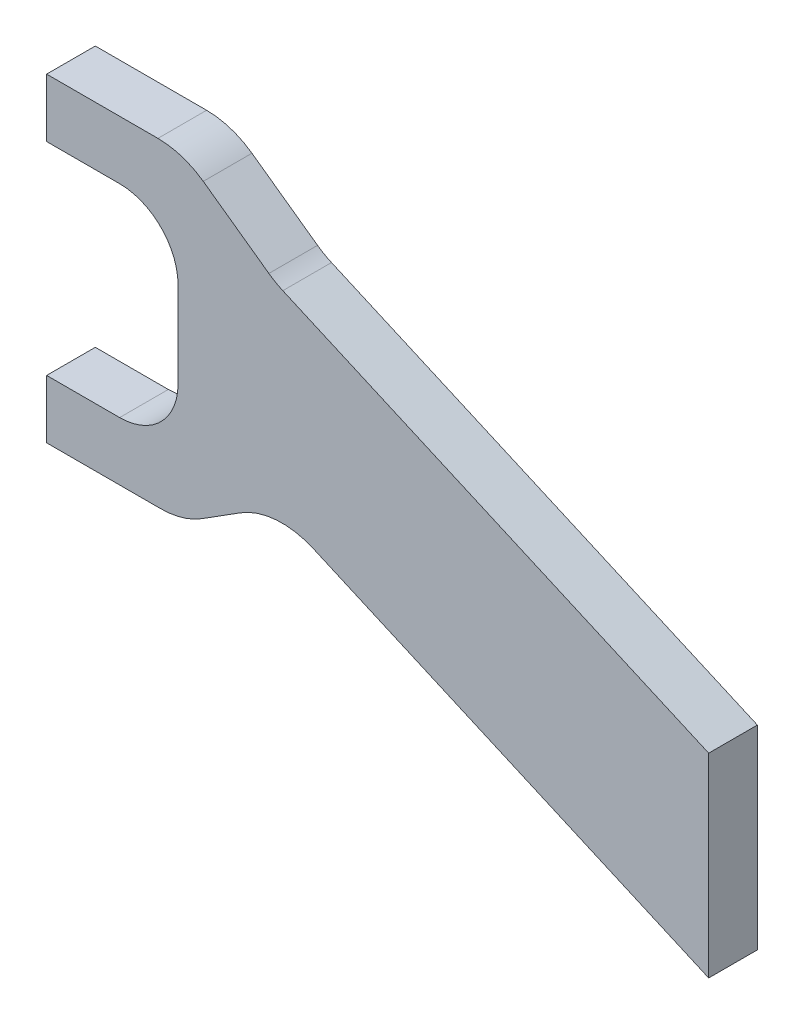
ISO-10303-21;
HEADER;
FILE_DESCRIPTION(('STEP AP214'),'2;1');
FILE_NAME('part.step','',(''),(''),'','','');
FILE_SCHEMA(('AUTOMOTIVE_DESIGN { 1 0 10303 214 1 1 1 1 }'));
ENDSEC;
DATA;
#1=APPLICATION_CONTEXT('core data for automotive mechanical design processes');
#2=APPLICATION_PROTOCOL_DEFINITION('international standard','automotive_design',2000,#1);
#3=PRODUCT_CONTEXT('',#1,'mechanical');
#4=PRODUCT('Part','Part','',(#3));
#5=PRODUCT_RELATED_PRODUCT_CATEGORY('part','',(#4));
#6=PRODUCT_DEFINITION_FORMATION('','',#4);
#7=PRODUCT_DEFINITION_CONTEXT('part definition',#1,'design');
#8=PRODUCT_DEFINITION('design','',#6,#7);
#9=PRODUCT_DEFINITION_SHAPE('','',#8);
#10=(LENGTH_UNIT() NAMED_UNIT(*) SI_UNIT(.MILLI.,.METRE.));
#11=(NAMED_UNIT(*) PLANE_ANGLE_UNIT() SI_UNIT($,.RADIAN.));
#12=(NAMED_UNIT(*) SI_UNIT($,.STERADIAN.) SOLID_ANGLE_UNIT());
#13=UNCERTAINTY_MEASURE_WITH_UNIT(LENGTH_MEASURE(1.E-05),#10,'distance_accuracy_value','');
#14=(GEOMETRIC_REPRESENTATION_CONTEXT(3) GLOBAL_UNCERTAINTY_ASSIGNED_CONTEXT((#13)) GLOBAL_UNIT_ASSIGNED_CONTEXT((#10,
#11,#12)) REPRESENTATION_CONTEXT('',''));
#15=CARTESIAN_POINT('',(0.,0.,0.));
#16=DIRECTION('',(0.,0.,1.));
#17=DIRECTION('',(1.,0.,0.));
#18=AXIS2_PLACEMENT_3D('',#15,#16,#17);
#19=CARTESIAN_POINT('',(0.7,1.64,0.125));
#20=DIRECTION('',(0.,-1.,0.));
#21=DIRECTION('',(1.,0.,0.));
#22=AXIS2_PLACEMENT_3D('',#19,#20,#21);
#23=PLANE('',#22);
#24=DIRECTION('',(-1.,0.,0.));
#25=VECTOR('',#24,1.);
#26=CARTESIAN_POINT('',(0.7,1.64,0.125));
#27=LINE('',#26,#25);
#28=CARTESIAN_POINT('',(0.571594501340175,1.64,0.125));
#29=VERTEX_POINT('',#28);
#30=CARTESIAN_POINT('',(0.,1.64,0.125));
#31=VERTEX_POINT('',#30);
#32=EDGE_CURVE('E156',#29,#31,#27,.T.);
#33=ORIENTED_EDGE('',*,*,#32,.F.);
#34=DIRECTION('',(0.,0.,-1.));
#35=VECTOR('',#34,1.);
#36=CARTESIAN_POINT('',(0.571594501340175,1.64,0.125));
#37=LINE('',#36,#35);
#38=CARTESIAN_POINT('',(0.571594501340175,1.64,-0.125));
#39=VERTEX_POINT('',#38);
#40=EDGE_CURVE('E229',#29,#39,#37,.T.);
#41=ORIENTED_EDGE('',*,*,#40,.T.);
#42=DIRECTION('',(-1.,0.,0.));
#43=VECTOR('',#42,1.);
#44=CARTESIAN_POINT('',(0.7,1.64,-0.125));
#45=LINE('',#44,#43);
#46=CARTESIAN_POINT('',(0.,1.64,-0.125));
#47=VERTEX_POINT('',#46);
#48=EDGE_CURVE('E181',#39,#47,#45,.T.);
#49=ORIENTED_EDGE('',*,*,#48,.T.);
#50=DIRECTION('',(0.,0.,-1.));
#51=VECTOR('',#50,1.);
#52=CARTESIAN_POINT('',(0.,1.64,0.125));
#53=LINE('',#52,#51);
#54=EDGE_CURVE('E174',#31,#47,#53,.T.);
#55=ORIENTED_EDGE('',*,*,#54,.F.);
#56=EDGE_LOOP('',(#33,#41,#49,#55));
#57=FACE_BOUND('',#56,.T.);
#58=ADVANCED_FACE('F33',(#57),#23,.F.);
#59=CARTESIAN_POINT('',(0.,1.64,0.125));
#60=DIRECTION('',(1.,0.,0.));
#61=DIRECTION('',(0.,1.,0.));
#62=AXIS2_PLACEMENT_3D('',#59,#60,#61);
#63=PLANE('',#62);
#64=DIRECTION('',(0.,-1.,0.));
#65=VECTOR('',#64,1.);
#66=CARTESIAN_POINT('',(0.,1.64,-0.125));
#67=LINE('',#66,#65);
#68=CARTESIAN_POINT('',(0.,1.34,-0.125));
#69=VERTEX_POINT('',#68);
#70=EDGE_CURVE('E265',#47,#69,#67,.T.);
#71=ORIENTED_EDGE('',*,*,#70,.T.);
#72=DIRECTION('',(0.,0.,-1.));
#73=VECTOR('',#72,1.);
#74=CARTESIAN_POINT('',(0.,1.34,0.125));
#75=LINE('',#74,#73);
#76=CARTESIAN_POINT('',(0.,1.34,0.125));
#77=VERTEX_POINT('',#76);
#78=EDGE_CURVE('E176',#77,#69,#75,.T.);
#79=ORIENTED_EDGE('',*,*,#78,.F.);
#80=DIRECTION('',(0.,-1.,0.));
#81=VECTOR('',#80,1.);
#82=CARTESIAN_POINT('',(0.,1.64,0.125));
#83=LINE('',#82,#81);
#84=EDGE_CURVE('E161',#31,#77,#83,.T.);
#85=ORIENTED_EDGE('',*,*,#84,.F.);
#86=ORIENTED_EDGE('',*,*,#54,.T.);
#87=EDGE_LOOP('',(#71,#79,#85,#86));
#88=FACE_BOUND('',#87,.T.);
#89=ADVANCED_FACE('F173',(#88),#63,.F.);
#90=CARTESIAN_POINT('',(0.,1.34,0.125));
#91=DIRECTION('',(0.,1.,0.));
#92=DIRECTION('',(0.,0.,1.));
#93=AXIS2_PLACEMENT_3D('',#90,#91,#92);
#94=PLANE('',#93);
#95=DIRECTION('',(1.,0.,0.));
#96=VECTOR('',#95,1.);
#97=CARTESIAN_POINT('',(0.,1.34,-0.125));
#98=LINE('',#97,#96);
#99=CARTESIAN_POINT('',(0.375,1.34,-0.125));
#100=VERTEX_POINT('',#99);
#101=EDGE_CURVE('E267',#69,#100,#98,.T.);
#102=ORIENTED_EDGE('',*,*,#101,.T.);
#103=DIRECTION('',(0.,0.,-1.));
#104=VECTOR('',#103,1.);
#105=CARTESIAN_POINT('',(0.375,1.34,0.125));
#106=LINE('',#105,#104);
#107=CARTESIAN_POINT('',(0.375,1.34,0.125));
#108=VERTEX_POINT('',#107);
#109=EDGE_CURVE('E196',#100,#108,#106,.F.);
#110=ORIENTED_EDGE('',*,*,#109,.T.);
#111=DIRECTION('',(1.,0.,0.));
#112=VECTOR('',#111,1.);
#113=CARTESIAN_POINT('',(0.,1.34,0.125));
#114=LINE('',#113,#112);
#115=EDGE_CURVE('E178',#77,#108,#114,.T.);
#116=ORIENTED_EDGE('',*,*,#115,.F.);
#117=ORIENTED_EDGE('',*,*,#78,.T.);
#118=EDGE_LOOP('',(#102,#110,#116,#117));
#119=FACE_BOUND('',#118,.T.);
#120=ADVANCED_FACE('F348',(#119),#94,.F.);
#121=CARTESIAN_POINT('',(0.675,1.34,0.125));
#122=DIRECTION('',(1.,0.,0.));
#123=DIRECTION('',(0.,0.,-1.));
#124=AXIS2_PLACEMENT_3D('',#121,#122,#123);
#125=PLANE('',#124);
#126=DIRECTION('',(0.,-1.,0.));
#127=VECTOR('',#126,1.);
#128=CARTESIAN_POINT('',(0.675,1.34,-0.125));
#129=LINE('',#128,#127);
#130=CARTESIAN_POINT('',(0.675,1.04,-0.125));
#131=VERTEX_POINT('',#130);
#132=CARTESIAN_POINT('',(0.675,0.6,-0.125));
#133=VERTEX_POINT('',#132);
#134=EDGE_CURVE('E270',#131,#133,#129,.T.);
#135=ORIENTED_EDGE('',*,*,#134,.T.);
#136=DIRECTION('',(0.,0.,-1.));
#137=VECTOR('',#136,1.);
#138=CARTESIAN_POINT('',(0.675,0.6,0.125));
#139=LINE('',#138,#137);
#140=CARTESIAN_POINT('',(0.675,0.6,0.125));
#141=VERTEX_POINT('',#140);
#142=EDGE_CURVE('E194',#133,#141,#139,.F.);
#143=ORIENTED_EDGE('',*,*,#142,.T.);
#144=DIRECTION('',(0.,-1.,0.));
#145=VECTOR('',#144,1.);
#146=CARTESIAN_POINT('',(0.675,1.34,0.125));
#147=LINE('',#146,#145);
#148=CARTESIAN_POINT('',(0.675,1.04,0.125));
#149=VERTEX_POINT('',#148);
#150=EDGE_CURVE('E365',#149,#141,#147,.T.);
#151=ORIENTED_EDGE('',*,*,#150,.F.);
#152=DIRECTION('',(0.,0.,-1.));
#153=VECTOR('',#152,1.);
#154=CARTESIAN_POINT('',(0.675,1.04,-0.125));
#155=LINE('',#154,#153);
#156=EDGE_CURVE('E186',#149,#131,#155,.T.);
#157=ORIENTED_EDGE('',*,*,#156,.T.);
#158=EDGE_LOOP('',(#135,#143,#151,#157));
#159=FACE_BOUND('',#158,.T.);
#160=ADVANCED_FACE('F368',(#159),#125,.F.);
#161=CARTESIAN_POINT('',(0.675,0.3,0.125));
#162=DIRECTION('',(0.,-1.,0.));
#163=DIRECTION('',(1.,0.,0.));
#164=AXIS2_PLACEMENT_3D('',#161,#162,#163);
#165=PLANE('',#164);
#166=DIRECTION('',(-1.,0.,0.));
#167=VECTOR('',#166,1.);
#168=CARTESIAN_POINT('',(0.675,0.3,0.125));
#169=LINE('',#168,#167);
#170=CARTESIAN_POINT('',(0.375,0.3,0.125));
#171=VERTEX_POINT('',#170);
#172=CARTESIAN_POINT('',(0.,0.3,0.125));
#173=VERTEX_POINT('',#172);
#174=EDGE_CURVE('E371',#171,#173,#169,.T.);
#175=ORIENTED_EDGE('',*,*,#174,.F.);
#176=DIRECTION('',(0.,0.,-1.));
#177=VECTOR('',#176,1.);
#178=CARTESIAN_POINT('',(0.375,0.3,-0.125));
#179=LINE('',#178,#177);
#180=CARTESIAN_POINT('',(0.375,0.3,-0.125));
#181=VERTEX_POINT('',#180);
#182=EDGE_CURVE('E183',#171,#181,#179,.T.);
#183=ORIENTED_EDGE('',*,*,#182,.T.);
#184=DIRECTION('',(-1.,0.,0.));
#185=VECTOR('',#184,1.);
#186=CARTESIAN_POINT('',(0.675,0.3,-0.125));
#187=LINE('',#186,#185);
#188=CARTESIAN_POINT('',(0.,0.3,-0.125));
#189=VERTEX_POINT('',#188);
#190=EDGE_CURVE('E273',#181,#189,#187,.T.);
#191=ORIENTED_EDGE('',*,*,#190,.T.);
#192=DIRECTION('',(0.,0.,-1.));
#193=VECTOR('',#192,1.);
#194=CARTESIAN_POINT('',(0.,0.3,0.125));
#195=LINE('',#194,#193);
#196=EDGE_CURVE('E188',#173,#189,#195,.T.);
#197=ORIENTED_EDGE('',*,*,#196,.F.);
#198=EDGE_LOOP('',(#175,#183,#191,#197));
#199=FACE_BOUND('',#198,.T.);
#200=ADVANCED_FACE('F376',(#199),#165,.F.);
#201=CARTESIAN_POINT('',(0.,0.3,0.125));
#202=DIRECTION('',(1.,0.,0.));
#203=DIRECTION('',(0.,1.,0.));
#204=AXIS2_PLACEMENT_3D('',#201,#202,#203);
#205=PLANE('',#204);
#206=DIRECTION('',(0.,-1.,0.));
#207=VECTOR('',#206,1.);
#208=CARTESIAN_POINT('',(0.,0.3,-0.125));
#209=LINE('',#208,#207);
#210=CARTESIAN_POINT('',(0.,0.,-0.125));
#211=VERTEX_POINT('',#210);
#212=EDGE_CURVE('E275',#189,#211,#209,.T.);
#213=ORIENTED_EDGE('',*,*,#212,.T.);
#214=DIRECTION('',(0.,0.,-1.));
#215=VECTOR('',#214,1.);
#216=CARTESIAN_POINT('',(0.,0.,0.125));
#217=LINE('',#216,#215);
#218=CARTESIAN_POINT('',(0.,0.,0.125));
#219=VERTEX_POINT('',#218);
#220=EDGE_CURVE('E289',#219,#211,#217,.T.);
#221=ORIENTED_EDGE('',*,*,#220,.F.);
#222=DIRECTION('',(0.,-1.,0.));
#223=VECTOR('',#222,1.);
#224=CARTESIAN_POINT('',(0.,0.3,0.125));
#225=LINE('',#224,#223);
#226=EDGE_CURVE('E298',#173,#219,#225,.T.);
#227=ORIENTED_EDGE('',*,*,#226,.F.);
#228=ORIENTED_EDGE('',*,*,#196,.T.);
#229=EDGE_LOOP('',(#213,#221,#227,#228));
#230=FACE_BOUND('',#229,.T.);
#231=ADVANCED_FACE('F296',(#230),#205,.F.);
#232=CARTESIAN_POINT('',(0.,0.,0.125));
#233=DIRECTION('',(0.,1.,0.));
#234=DIRECTION('',(0.,0.,1.));
#235=AXIS2_PLACEMENT_3D('',#232,#233,#234);
#236=PLANE('',#235);
#237=DIRECTION('',(1.,0.,0.));
#238=VECTOR('',#237,1.);
#239=CARTESIAN_POINT('',(0.,0.,-0.125));
#240=LINE('',#239,#238);
#241=CARTESIAN_POINT('',(0.584259831525192,0.,-0.125));
#242=VERTEX_POINT('',#241);
#243=EDGE_CURVE('E277',#211,#242,#240,.T.);
#244=ORIENTED_EDGE('',*,*,#243,.T.);
#245=DIRECTION('',(0.,0.,-1.));
#246=VECTOR('',#245,1.);
#247=CARTESIAN_POINT('',(0.584259831525192,0.,0.125));
#248=LINE('',#247,#246);
#249=CARTESIAN_POINT('',(0.584259831525192,0.,0.125));
#250=VERTEX_POINT('',#249);
#251=EDGE_CURVE('E215',#242,#250,#248,.F.);
#252=ORIENTED_EDGE('',*,*,#251,.T.);
#253=DIRECTION('',(1.,0.,0.));
#254=VECTOR('',#253,1.);
#255=CARTESIAN_POINT('',(0.,0.,0.125));
#256=LINE('',#255,#254);
#257=EDGE_CURVE('E315',#219,#250,#256,.T.);
#258=ORIENTED_EDGE('',*,*,#257,.F.);
#259=ORIENTED_EDGE('',*,*,#220,.T.);
#260=EDGE_LOOP('',(#244,#252,#258,#259));
#261=FACE_BOUND('',#260,.T.);
#262=ADVANCED_FACE('F305',(#261),#236,.F.);
#263=CARTESIAN_POINT('',(0.7,0.,0.125));
#264=DIRECTION('',(-0.533992991387982,0.845488903030971,0.));
#265=DIRECTION('',(-0.845488903030971,-0.533992991387982,0.));
#266=AXIS2_PLACEMENT_3D('',#263,#264,#265);
#267=PLANE('',#266);
#268=DIRECTION('',(0.845488903030971,0.533992991387982,0.));
#269=VECTOR('',#268,1.);
#270=CARTESIAN_POINT('',(0.7,0.,0.125));
#271=LINE('',#270,#269);
#272=CARTESIAN_POINT('',(0.797857028080385,0.0618044387876115,0.125));
#273=VERTEX_POINT('',#272);
#274=CARTESIAN_POINT('',(0.995001364598637,0.186316651325455,0.125));
#275=VERTEX_POINT('',#274);
#276=EDGE_CURVE('E313',#273,#275,#271,.T.);
#277=ORIENTED_EDGE('',*,*,#276,.F.);
#278=DIRECTION('',(0.,0.,-1.));
#279=VECTOR('',#278,1.);
#280=CARTESIAN_POINT('',(0.797857028080385,0.0618044387876115,0.125));
#281=LINE('',#280,#279);
#282=CARTESIAN_POINT('',(0.797857028080385,0.0618044387876115,-0.125));
#283=VERTEX_POINT('',#282);
#284=EDGE_CURVE('E208',#273,#283,#281,.T.);
#285=ORIENTED_EDGE('',*,*,#284,.T.);
#286=DIRECTION('',(0.845488903030971,0.533992991387982,0.));
#287=VECTOR('',#286,1.);
#288=CARTESIAN_POINT('',(0.7,0.,-0.125));
#289=LINE('',#288,#287);
#290=CARTESIAN_POINT('',(0.995001364598637,0.186316651325455,-0.125));
#291=VERTEX_POINT('',#290);
#292=EDGE_CURVE('E280',#283,#291,#289,.T.);
#293=ORIENTED_EDGE('',*,*,#292,.T.);
#294=DIRECTION('',(0.,0.,-1.));
#295=VECTOR('',#294,1.);
#296=CARTESIAN_POINT('',(0.995001364598637,0.186316651325455,0.125));
#297=LINE('',#296,#295);
#298=EDGE_CURVE('E206',#291,#275,#297,.F.);
#299=ORIENTED_EDGE('',*,*,#298,.T.);
#300=EDGE_LOOP('',(#277,#285,#293,#299));
#301=FACE_BOUND('',#300,.T.);
#302=ADVANCED_FACE('F317',(#301),#267,.F.);
#303=CARTESIAN_POINT('',(1.175,0.3,0.125));
#304=DIRECTION('',(0.403083181375616,0.915163345470147,0.));
#305=DIRECTION('',(-0.915163345470148,0.403083181375616,0.));
#306=AXIS2_PLACEMENT_3D('',#303,#304,#305);
#307=PLANE('',#306);
#308=DIRECTION('',(0.915163345470147,-0.403083181375616,0.));
#309=VECTOR('',#308,1.);
#310=CARTESIAN_POINT('',(1.175,0.3,0.125));
#311=LINE('',#310,#309);
#312=CARTESIAN_POINT('',(1.36983183370408,0.214186428301126,0.125));
#313=VERTEX_POINT('',#312);
#314=CARTESIAN_POINT('',(3.4,-0.68,0.125));
#315=VERTEX_POINT('',#314);
#316=EDGE_CURVE('E319',#313,#315,#311,.T.);
#317=ORIENTED_EDGE('',*,*,#316,.F.);
#318=DIRECTION('',(0.,0.,-1.));
#319=VECTOR('',#318,1.);
#320=CARTESIAN_POINT('',(1.36983183370408,0.214186428301126,-0.125));
#321=LINE('',#320,#319);
#322=CARTESIAN_POINT('',(1.36983183370408,0.214186428301126,-0.125));
#323=VERTEX_POINT('',#322);
#324=EDGE_CURVE('E220',#313,#323,#321,.T.);
#325=ORIENTED_EDGE('',*,*,#324,.T.);
#326=DIRECTION('',(0.915163345470147,-0.403083181375616,0.));
#327=VECTOR('',#326,1.);
#328=CARTESIAN_POINT('',(1.175,0.3,-0.125));
#329=LINE('',#328,#327);
#330=CARTESIAN_POINT('',(3.4,-0.68,-0.125));
#331=VERTEX_POINT('',#330);
#332=EDGE_CURVE('E283',#323,#331,#329,.T.);
#333=ORIENTED_EDGE('',*,*,#332,.T.);
#334=DIRECTION('',(0.,0.,-1.));
#335=VECTOR('',#334,1.);
#336=CARTESIAN_POINT('',(3.4,-0.68,0.125));
#337=LINE('',#336,#335);
#338=EDGE_CURVE('E258',#315,#331,#337,.T.);
#339=ORIENTED_EDGE('',*,*,#338,.F.);
#340=EDGE_LOOP('',(#317,#325,#333,#339));
#341=FACE_BOUND('',#340,.T.);
#342=ADVANCED_FACE('F331',(#341),#307,.F.);
#343=CARTESIAN_POINT('',(3.4,-0.68,0.125));
#344=DIRECTION('',(-1.,0.,0.));
#345=DIRECTION('',(0.,0.,1.));
#346=AXIS2_PLACEMENT_3D('',#343,#344,#345);
#347=PLANE('',#346);
#348=DIRECTION('',(0.,1.,0.));
#349=VECTOR('',#348,1.);
#350=CARTESIAN_POINT('',(3.4,-0.68,-0.125));
#351=LINE('',#350,#349);
#352=CARTESIAN_POINT('',(3.4,0.32,-0.125));
#353=VERTEX_POINT('',#352);
#354=EDGE_CURVE('E251',#331,#353,#351,.T.);
#355=ORIENTED_EDGE('',*,*,#354,.T.);
#356=DIRECTION('',(0.,0.,-1.));
#357=VECTOR('',#356,1.);
#358=CARTESIAN_POINT('',(3.4,0.32,0.125));
#359=LINE('',#358,#357);
#360=CARTESIAN_POINT('',(3.4,0.32,0.125));
#361=VERTEX_POINT('',#360);
#362=EDGE_CURVE('E250',#361,#353,#359,.T.);
#363=ORIENTED_EDGE('',*,*,#362,.F.);
#364=DIRECTION('',(0.,1.,0.));
#365=VECTOR('',#364,1.);
#366=CARTESIAN_POINT('',(3.4,-0.68,0.125));
#367=LINE('',#366,#365);
#368=EDGE_CURVE('E260',#315,#361,#367,.T.);
#369=ORIENTED_EDGE('',*,*,#368,.F.);
#370=ORIENTED_EDGE('',*,*,#338,.T.);
#371=EDGE_LOOP('',(#355,#363,#369,#370));
#372=FACE_BOUND('',#371,.T.);
#373=ADVANCED_FACE('F328',(#372),#347,.F.);
#374=CARTESIAN_POINT('',(3.4,0.32,0.125));
#375=DIRECTION('',(-0.403083181375616,-0.915163345470147,0.));
#376=DIRECTION('',(0.915163345470148,-0.403083181375616,0.));
#377=AXIS2_PLACEMENT_3D('',#374,#375,#376);
#378=PLANE('',#377);
#379=DIRECTION('',(-0.915163345470147,0.403083181375615,0.));
#380=VECTOR('',#379,1.);
#381=CARTESIAN_POINT('',(3.4,0.32,-0.125));
#382=LINE('',#381,#380);
#383=CARTESIAN_POINT('',(1.21290544589138,1.28330456765234,-0.125));
#384=VERTEX_POINT('',#383);
#385=EDGE_CURVE('E241',#353,#384,#382,.T.);
#386=ORIENTED_EDGE('',*,*,#385,.T.);
#387=DIRECTION('',(0.,0.,-1.));
#388=VECTOR('',#387,1.);
#389=CARTESIAN_POINT('',(1.21290544589138,1.28330456765234,0.125));
#390=LINE('',#389,#388);
#391=CARTESIAN_POINT('',(1.21290544589138,1.28330456765234,0.125));
#392=VERTEX_POINT('',#391);
#393=EDGE_CURVE('E227',#384,#392,#390,.F.);
#394=ORIENTED_EDGE('',*,*,#393,.T.);
#395=DIRECTION('',(-0.915163345470147,0.403083181375615,0.));
#396=VECTOR('',#395,1.);
#397=CARTESIAN_POINT('',(3.4,0.32,0.125));
#398=LINE('',#397,#396);
#399=EDGE_CURVE('E256',#361,#392,#398,.T.);
#400=ORIENTED_EDGE('',*,*,#399,.F.);
#401=ORIENTED_EDGE('',*,*,#362,.T.);
#402=EDGE_LOOP('',(#386,#394,#400,#401));
#403=FACE_BOUND('',#402,.T.);
#404=ADVANCED_FACE('F247',(#403),#378,.F.);
#405=CARTESIAN_POINT('',(1.175,1.3,0.125));
#406=DIRECTION('',(-0.582047590629905,-0.813154722203544,0.));
#407=DIRECTION('',(0.813154722203544,-0.582047590629905,0.));
#408=AXIS2_PLACEMENT_3D('',#405,#406,#407);
#409=PLANE('',#408);
#410=DIRECTION('',(-0.813154722203544,0.582047590629905,0.));
#411=VECTOR('',#410,1.);
#412=CARTESIAN_POINT('',(1.175,1.3,0.125));
#413=LINE('',#412,#411);
#414=CARTESIAN_POINT('',(1.14131968218966,1.32410801695898,0.125));
#415=VERTEX_POINT('',#414);
#416=CARTESIAN_POINT('',(0.804413537592137,1.56526188888142,0.125));
#417=VERTEX_POINT('',#416);
#418=EDGE_CURVE('E255',#415,#417,#413,.T.);
#419=ORIENTED_EDGE('',*,*,#418,.F.);
#420=DIRECTION('',(0.,0.,-1.));
#421=VECTOR('',#420,1.);
#422=CARTESIAN_POINT('',(1.14131968218966,1.32410801695898,-0.125));
#423=LINE('',#422,#421);
#424=CARTESIAN_POINT('',(1.14131968218966,1.32410801695898,-0.125));
#425=VERTEX_POINT('',#424);
#426=EDGE_CURVE('E224',#415,#425,#423,.T.);
#427=ORIENTED_EDGE('',*,*,#426,.T.);
#428=DIRECTION('',(-0.813154722203544,0.582047590629905,0.));
#429=VECTOR('',#428,1.);
#430=CARTESIAN_POINT('',(1.175,1.3,-0.125));
#431=LINE('',#430,#429);
#432=CARTESIAN_POINT('',(0.804413537592137,1.56526188888142,-0.125));
#433=VERTEX_POINT('',#432);
#434=EDGE_CURVE('E169',#425,#433,#431,.T.);
#435=ORIENTED_EDGE('',*,*,#434,.T.);
#436=DIRECTION('',(0.,0.,-1.));
#437=VECTOR('',#436,1.);
#438=CARTESIAN_POINT('',(0.804413537592137,1.56526188888142,0.125));
#439=LINE('',#438,#437);
#440=EDGE_CURVE('E48',#433,#417,#439,.F.);
#441=ORIENTED_EDGE('',*,*,#440,.T.);
#442=EDGE_LOOP('',(#419,#427,#435,#441));
#443=FACE_BOUND('',#442,.T.);
#444=ADVANCED_FACE('F254',(#443),#409,.F.);
#445=CARTESIAN_POINT('',(0.,0.,0.125));
#446=DIRECTION('',(0.,0.,1.));
#447=DIRECTION('',(1.,0.,0.));
#448=AXIS2_PLACEMENT_3D('',#445,#446,#447);
#449=PLANE('',#448);
#450=ORIENTED_EDGE('',*,*,#257,.T.);
#451=CARTESIAN_POINT('',(0.584259831525192,0.4,0.125));
#452=DIRECTION('',(0.,0.,1.));
#453=DIRECTION('',(1.,0.,0.));
#454=AXIS2_PLACEMENT_3D('',#451,#452,#453);
#455=CIRCLE('',#454,0.4);
#456=EDGE_CURVE('E218',#250,#273,#455,.T.);
#457=ORIENTED_EDGE('',*,*,#456,.T.);
#458=ORIENTED_EDGE('',*,*,#276,.T.);
#459=CARTESIAN_POINT('',(1.20859856115383,-0.151878909886933,0.125));
#460=DIRECTION('',(0.,0.,1.));
#461=DIRECTION('',(1.,0.,0.));
#462=AXIS2_PLACEMENT_3D('',#459,#460,#461);
#463=CIRCLE('',#462,0.4);
#464=EDGE_CURVE('E233',#275,#313,#463,.F.);
#465=ORIENTED_EDGE('',*,*,#464,.T.);
#466=ORIENTED_EDGE('',*,*,#316,.T.);
#467=ORIENTED_EDGE('',*,*,#368,.T.);
#468=ORIENTED_EDGE('',*,*,#399,.T.);
#469=CARTESIAN_POINT('',(1.37413871844163,1.6493699058404,0.125));
#470=DIRECTION('',(0.,0.,1.));
#471=DIRECTION('',(1.,0.,0.));
#472=AXIS2_PLACEMENT_3D('',#469,#470,#471);
#473=CIRCLE('',#472,0.4);
#474=EDGE_CURVE('E11',#392,#415,#473,.F.);
#475=ORIENTED_EDGE('',*,*,#474,.T.);
#476=ORIENTED_EDGE('',*,*,#418,.T.);
#477=CARTESIAN_POINT('',(0.571594501340175,1.24,0.125));
#478=DIRECTION('',(0.,0.,1.));
#479=DIRECTION('',(1.,0.,0.));
#480=AXIS2_PLACEMENT_3D('',#477,#478,#479);
#481=CIRCLE('',#480,0.4);
#482=EDGE_CURVE('E164',#417,#29,#481,.T.);
#483=ORIENTED_EDGE('',*,*,#482,.T.);
#484=ORIENTED_EDGE('',*,*,#32,.T.);
#485=ORIENTED_EDGE('',*,*,#84,.T.);
#486=ORIENTED_EDGE('',*,*,#115,.T.);
#487=CARTESIAN_POINT('',(0.375,1.04,0.125));
#488=DIRECTION('',(0.,0.,1.));
#489=DIRECTION('',(1.,0.,0.));
#490=AXIS2_PLACEMENT_3D('',#487,#488,#489);
#491=CIRCLE('',#490,0.3);
#492=EDGE_CURVE('E204',#108,#149,#491,.F.);
#493=ORIENTED_EDGE('',*,*,#492,.T.);
#494=ORIENTED_EDGE('',*,*,#150,.T.);
#495=CARTESIAN_POINT('',(0.375,0.6,0.125));
#496=DIRECTION('',(0.,0.,1.));
#497=DIRECTION('',(1.,0.,0.));
#498=AXIS2_PLACEMENT_3D('',#495,#496,#497);
#499=CIRCLE('',#498,0.3);
#500=EDGE_CURVE('E200',#141,#171,#499,.F.);
#501=ORIENTED_EDGE('',*,*,#500,.T.);
#502=ORIENTED_EDGE('',*,*,#174,.T.);
#503=ORIENTED_EDGE('',*,*,#226,.T.);
#504=EDGE_LOOP('',(#450,#457,#458,#465,#466,#467,#468,#475,#476,#483,#484,#485,#486,#493,#494,
#501,#502,#503));
#505=FACE_BOUND('',#504,.T.);
#506=ADVANCED_FACE('F159',(#505),#449,.T.);
#507=CARTESIAN_POINT('',(0.,0.,-0.125));
#508=DIRECTION('',(0.,0.,1.));
#509=DIRECTION('',(1.,0.,0.));
#510=AXIS2_PLACEMENT_3D('',#507,#508,#509);
#511=PLANE('',#510);
#512=ORIENTED_EDGE('',*,*,#292,.F.);
#513=CARTESIAN_POINT('',(0.584259831525192,0.4,-0.125));
#514=DIRECTION('',(0.,0.,1.));
#515=DIRECTION('',(1.,0.,0.));
#516=AXIS2_PLACEMENT_3D('',#513,#514,#515);
#517=CIRCLE('',#516,0.4);
#518=EDGE_CURVE('E213',#283,#242,#517,.F.);
#519=ORIENTED_EDGE('',*,*,#518,.T.);
#520=ORIENTED_EDGE('',*,*,#243,.F.);
#521=ORIENTED_EDGE('',*,*,#212,.F.);
#522=ORIENTED_EDGE('',*,*,#190,.F.);
#523=CARTESIAN_POINT('',(0.375,0.6,-0.125));
#524=DIRECTION('',(0.,0.,1.));
#525=DIRECTION('',(1.,0.,0.));
#526=AXIS2_PLACEMENT_3D('',#523,#524,#525);
#527=CIRCLE('',#526,0.3);
#528=EDGE_CURVE('E198',#181,#133,#527,.T.);
#529=ORIENTED_EDGE('',*,*,#528,.T.);
#530=ORIENTED_EDGE('',*,*,#134,.F.);
#531=CARTESIAN_POINT('',(0.375,1.04,-0.125));
#532=DIRECTION('',(0.,0.,1.));
#533=DIRECTION('',(1.,0.,0.));
#534=AXIS2_PLACEMENT_3D('',#531,#532,#533);
#535=CIRCLE('',#534,0.3);
#536=EDGE_CURVE('E202',#131,#100,#535,.T.);
#537=ORIENTED_EDGE('',*,*,#536,.T.);
#538=ORIENTED_EDGE('',*,*,#101,.F.);
#539=ORIENTED_EDGE('',*,*,#70,.F.);
#540=ORIENTED_EDGE('',*,*,#48,.F.);
#541=CARTESIAN_POINT('',(0.571594501340175,1.24,-0.125));
#542=DIRECTION('',(0.,0.,1.));
#543=DIRECTION('',(1.,0.,0.));
#544=AXIS2_PLACEMENT_3D('',#541,#542,#543);
#545=CIRCLE('',#544,0.4);
#546=EDGE_CURVE('E211',#39,#433,#545,.F.);
#547=ORIENTED_EDGE('',*,*,#546,.T.);
#548=ORIENTED_EDGE('',*,*,#434,.F.);
#549=CARTESIAN_POINT('',(1.37413871844163,1.6493699058404,-0.125));
#550=DIRECTION('',(0.,0.,1.));
#551=DIRECTION('',(1.,0.,0.));
#552=AXIS2_PLACEMENT_3D('',#549,#550,#551);
#553=CIRCLE('',#552,0.4);
#554=EDGE_CURVE('E41',#425,#384,#553,.T.);
#555=ORIENTED_EDGE('',*,*,#554,.T.);
#556=ORIENTED_EDGE('',*,*,#385,.F.);
#557=ORIENTED_EDGE('',*,*,#354,.F.);
#558=ORIENTED_EDGE('',*,*,#332,.F.);
#559=CARTESIAN_POINT('',(1.20859856115383,-0.151878909886933,-0.125));
#560=DIRECTION('',(0.,0.,1.));
#561=DIRECTION('',(1.,0.,0.));
#562=AXIS2_PLACEMENT_3D('',#559,#560,#561);
#563=CIRCLE('',#562,0.4);
#564=EDGE_CURVE('E231',#323,#291,#563,.T.);
#565=ORIENTED_EDGE('',*,*,#564,.T.);
#566=EDGE_LOOP('',(#512,#519,#520,#521,#522,#529,#530,#537,#538,#539,#540,#547,#548,#555,#556,
#557,#558,#565));
#567=FACE_BOUND('',#566,.T.);
#568=ADVANCED_FACE('F239',(#567),#511,.F.);
#569=CARTESIAN_POINT('',(0.375,0.6,0.125));
#570=DIRECTION('',(0.,0.,1.));
#571=DIRECTION('',(1.,0.,0.));
#572=AXIS2_PLACEMENT_3D('',#569,#570,#571);
#573=CYLINDRICAL_SURFACE('',#572,0.3);
#574=ORIENTED_EDGE('',*,*,#500,.F.);
#575=ORIENTED_EDGE('',*,*,#142,.F.);
#576=ORIENTED_EDGE('',*,*,#528,.F.);
#577=ORIENTED_EDGE('',*,*,#182,.F.);
#578=EDGE_LOOP('',(#574,#575,#576,#577));
#579=FACE_BOUND('',#578,.T.);
#580=ADVANCED_FACE('F352',(#579),#573,.F.);
#581=CARTESIAN_POINT('',(0.375,1.04,0.125));
#582=DIRECTION('',(0.,0.,1.));
#583=DIRECTION('',(1.,0.,0.));
#584=AXIS2_PLACEMENT_3D('',#581,#582,#583);
#585=CYLINDRICAL_SURFACE('',#584,0.3);
#586=ORIENTED_EDGE('',*,*,#492,.F.);
#587=ORIENTED_EDGE('',*,*,#109,.F.);
#588=ORIENTED_EDGE('',*,*,#536,.F.);
#589=ORIENTED_EDGE('',*,*,#156,.F.);
#590=EDGE_LOOP('',(#586,#587,#588,#589));
#591=FACE_BOUND('',#590,.T.);
#592=ADVANCED_FACE('F341',(#591),#585,.F.);
#593=CARTESIAN_POINT('',(0.584259831525192,0.4,0.125));
#594=DIRECTION('',(0.,0.,-1.));
#595=DIRECTION('',(-1.,0.,0.));
#596=AXIS2_PLACEMENT_3D('',#593,#594,#595);
#597=CYLINDRICAL_SURFACE('',#596,0.4);
#598=ORIENTED_EDGE('',*,*,#456,.F.);
#599=ORIENTED_EDGE('',*,*,#251,.F.);
#600=ORIENTED_EDGE('',*,*,#518,.F.);
#601=ORIENTED_EDGE('',*,*,#284,.F.);
#602=EDGE_LOOP('',(#598,#599,#600,#601));
#603=FACE_BOUND('',#602,.T.);
#604=ADVANCED_FACE('F309',(#603),#597,.T.);
#605=CARTESIAN_POINT('',(1.20859856115383,-0.151878909886933,0.125));
#606=DIRECTION('',(0.,0.,1.));
#607=DIRECTION('',(1.,0.,0.));
#608=AXIS2_PLACEMENT_3D('',#605,#606,#607);
#609=CYLINDRICAL_SURFACE('',#608,0.4);
#610=ORIENTED_EDGE('',*,*,#464,.F.);
#611=ORIENTED_EDGE('',*,*,#298,.F.);
#612=ORIENTED_EDGE('',*,*,#564,.F.);
#613=ORIENTED_EDGE('',*,*,#324,.F.);
#614=EDGE_LOOP('',(#610,#611,#612,#613));
#615=FACE_BOUND('',#614,.T.);
#616=ADVANCED_FACE('F334',(#615),#609,.F.);
#617=CARTESIAN_POINT('',(1.37413871844163,1.6493699058404,0.125));
#618=DIRECTION('',(0.,0.,1.));
#619=DIRECTION('',(1.,0.,0.));
#620=AXIS2_PLACEMENT_3D('',#617,#618,#619);
#621=CYLINDRICAL_SURFACE('',#620,0.4);
#622=ORIENTED_EDGE('',*,*,#474,.F.);
#623=ORIENTED_EDGE('',*,*,#393,.F.);
#624=ORIENTED_EDGE('',*,*,#554,.F.);
#625=ORIENTED_EDGE('',*,*,#426,.F.);
#626=EDGE_LOOP('',(#622,#623,#624,#625));
#627=FACE_BOUND('',#626,.T.);
#628=ADVANCED_FACE('F253',(#627),#621,.F.);
#629=CARTESIAN_POINT('',(0.571594501340175,1.24,0.125));
#630=DIRECTION('',(0.,0.,-1.));
#631=DIRECTION('',(-1.,0.,0.));
#632=AXIS2_PLACEMENT_3D('',#629,#630,#631);
#633=CYLINDRICAL_SURFACE('',#632,0.4);
#634=ORIENTED_EDGE('',*,*,#482,.F.);
#635=ORIENTED_EDGE('',*,*,#440,.F.);
#636=ORIENTED_EDGE('',*,*,#546,.F.);
#637=ORIENTED_EDGE('',*,*,#40,.F.);
#638=EDGE_LOOP('',(#634,#635,#636,#637));
#639=FACE_BOUND('',#638,.T.);
#640=ADVANCED_FACE('F35',(#639),#633,.T.);
#641=CLOSED_SHELL('',(#58,#89,#120,#160,#200,#231,#262,#302,#342,#373,#404,#444,#506,#568,#580,
#592,#604,#616,#628,#640));
#642=MANIFOLD_SOLID_BREP('B2',#641);
#643=ADVANCED_BREP_SHAPE_REPRESENTATION('',(#18,#642),#14);
#644=SHAPE_DEFINITION_REPRESENTATION(#9,#643);
ENDSEC;
END-ISO-10303-21;
